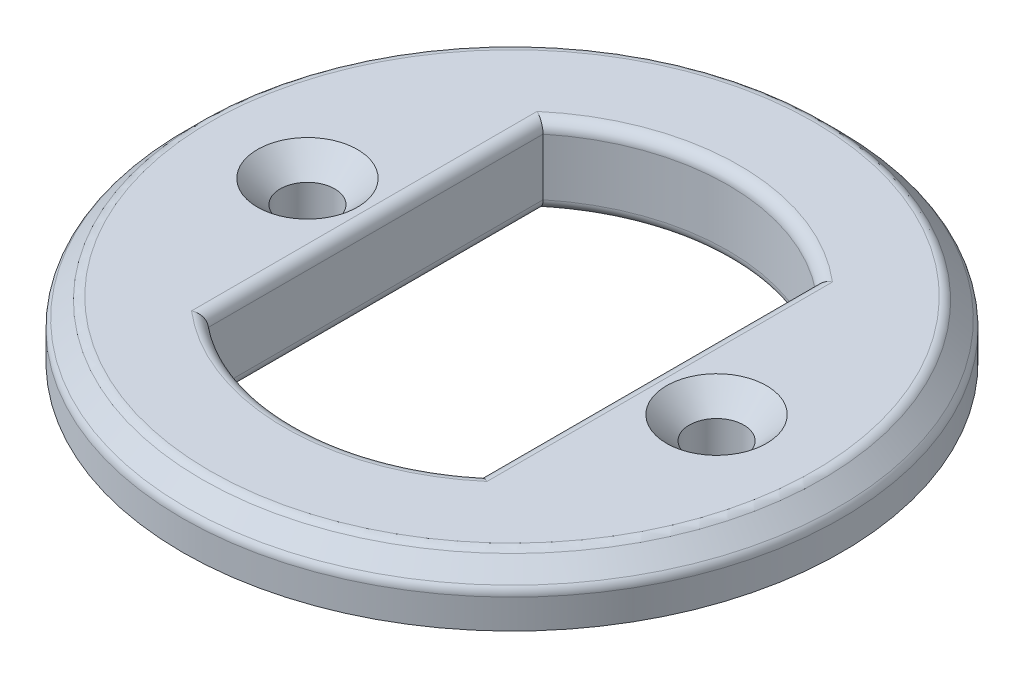
ISO-10303-21;
HEADER;
FILE_DESCRIPTION(('STEP AP214'),'2;1');
FILE_NAME('part.step','',(''),(''),'','','');
FILE_SCHEMA(('AUTOMOTIVE_DESIGN { 1 0 10303 214 1 1 1 1 }'));
ENDSEC;
DATA;
#1=APPLICATION_CONTEXT('core data for automotive mechanical design processes');
#2=APPLICATION_PROTOCOL_DEFINITION('international standard','automotive_design',2000,#1);
#3=PRODUCT_CONTEXT('',#1,'mechanical');
#4=PRODUCT('Part','Part','',(#3));
#5=PRODUCT_RELATED_PRODUCT_CATEGORY('part','',(#4));
#6=PRODUCT_DEFINITION_FORMATION('','',#4);
#7=PRODUCT_DEFINITION_CONTEXT('part definition',#1,'design');
#8=PRODUCT_DEFINITION('design','',#6,#7);
#9=PRODUCT_DEFINITION_SHAPE('','',#8);
#10=(LENGTH_UNIT() NAMED_UNIT(*) SI_UNIT(.MILLI.,.METRE.));
#11=(NAMED_UNIT(*) PLANE_ANGLE_UNIT() SI_UNIT($,.RADIAN.));
#12=(NAMED_UNIT(*) SI_UNIT($,.STERADIAN.) SOLID_ANGLE_UNIT());
#13=UNCERTAINTY_MEASURE_WITH_UNIT(LENGTH_MEASURE(1.E-05),#10,'distance_accuracy_value','');
#14=(GEOMETRIC_REPRESENTATION_CONTEXT(3) GLOBAL_UNCERTAINTY_ASSIGNED_CONTEXT((#13)) GLOBAL_UNIT_ASSIGNED_CONTEXT((#10,
#11,#12)) REPRESENTATION_CONTEXT('',''));
#15=CARTESIAN_POINT('',(0.,0.,0.));
#16=DIRECTION('',(0.,0.,1.));
#17=DIRECTION('',(1.,0.,0.));
#18=AXIS2_PLACEMENT_3D('',#15,#16,#17);
#19=CARTESIAN_POINT('',(12.,0.,0.));
#20=DIRECTION('',(0.,-1.,0.));
#21=DIRECTION('',(0.,0.,-1.));
#22=AXIS2_PLACEMENT_3D('',#19,#20,#21);
#23=PLANE('',#22);
#24=CARTESIAN_POINT('',(-9.,0.,0.));
#25=DIRECTION('',(0.,1.,0.));
#26=DIRECTION('',(0.,0.,1.));
#27=AXIS2_PLACEMENT_3D('',#24,#25,#26);
#28=CIRCLE('',#27,1.2);
#29=CARTESIAN_POINT('',(-9.,0.,1.2));
#30=VERTEX_POINT('',#29);
#31=EDGE_CURVE('E350',#30,#30,#28,.T.);
#32=ORIENTED_EDGE('',*,*,#31,.T.);
#33=EDGE_LOOP('',(#32));
#34=FACE_BOUND('',#33,.T.);
#35=CARTESIAN_POINT('',(9.,0.,0.));
#36=DIRECTION('',(0.,1.,0.));
#37=DIRECTION('',(0.,0.,1.));
#38=AXIS2_PLACEMENT_3D('',#35,#36,#37);
#39=CIRCLE('',#38,1.2);
#40=CARTESIAN_POINT('',(9.,0.,1.20000000000001));
#41=VERTEX_POINT('',#40);
#42=EDGE_CURVE('E360',#41,#41,#39,.T.);
#43=ORIENTED_EDGE('',*,*,#42,.T.);
#44=EDGE_LOOP('',(#43));
#45=FACE_BOUND('',#44,.T.);
#46=CARTESIAN_POINT('',(0.,0.,0.));
#47=DIRECTION('',(0.,-1.,0.));
#48=DIRECTION('',(0.,0.,-1.));
#49=AXIS2_PLACEMENT_3D('',#46,#47,#48);
#50=CIRCLE('',#49,10.);
#51=CARTESIAN_POINT('',(-6.5,0.,7.59934207678536));
#52=VERTEX_POINT('',#51);
#53=CARTESIAN_POINT('',(6.5,0.,7.59934207678531));
#54=VERTEX_POINT('',#53);
#55=EDGE_CURVE('E52',#52,#54,#50,.F.);
#56=ORIENTED_EDGE('',*,*,#55,.T.);
#57=DIRECTION('',(0.,0.,-1.));
#58=VECTOR('',#57,1.);
#59=CARTESIAN_POINT('',(6.49999999999997,0.,-7.36545993132812));
#60=LINE('',#59,#58);
#61=CARTESIAN_POINT('',(6.49999999999997,0.,-7.59934207678533));
#62=VERTEX_POINT('',#61);
#63=EDGE_CURVE('E11',#54,#62,#60,.T.);
#64=ORIENTED_EDGE('',*,*,#63,.T.);
#65=CARTESIAN_POINT('',(0.,0.,0.));
#66=DIRECTION('',(0.,-1.,0.));
#67=DIRECTION('',(0.,0.,-1.));
#68=AXIS2_PLACEMENT_3D('',#65,#66,#67);
#69=CIRCLE('',#68,10.);
#70=CARTESIAN_POINT('',(-6.5,0.,-7.59934207678532));
#71=VERTEX_POINT('',#70);
#72=EDGE_CURVE('E158',#62,#71,#69,.F.);
#73=ORIENTED_EDGE('',*,*,#72,.T.);
#74=DIRECTION('',(0.,0.,1.));
#75=VECTOR('',#74,1.);
#76=CARTESIAN_POINT('',(-6.5,0.,7.36545993132814));
#77=LINE('',#76,#75);
#78=EDGE_CURVE('E63',#71,#52,#77,.T.);
#79=ORIENTED_EDGE('',*,*,#78,.T.);
#80=EDGE_LOOP('',(#56,#64,#73,#79));
#81=FACE_BOUND('',#80,.T.);
#82=CARTESIAN_POINT('',(0.,0.,0.));
#83=DIRECTION('',(0.,-1.,0.));
#84=DIRECTION('',(0.,0.,-1.));
#85=AXIS2_PLACEMENT_3D('',#82,#83,#84);
#86=CIRCLE('',#85,12.);
#87=CARTESIAN_POINT('',(0.,0.,-12.));
#88=VERTEX_POINT('',#87);
#89=EDGE_CURVE('E287',#88,#88,#86,.T.);
#90=ORIENTED_EDGE('',*,*,#89,.T.);
#91=EDGE_LOOP('',(#90));
#92=FACE_BOUND('',#91,.T.);
#93=ADVANCED_FACE('F39',(#34,#45,#81,#92),#23,.T.);
#94=CARTESIAN_POINT('',(13.4999999999999,3.5,0.));
#95=DIRECTION('',(0.,1.,0.));
#96=DIRECTION('',(0.,0.,1.));
#97=AXIS2_PLACEMENT_3D('',#94,#95,#96);
#98=PLANE('',#97);
#99=CARTESIAN_POINT('',(-9.,3.5,0.));
#100=DIRECTION('',(0.,1.,0.));
#101=DIRECTION('',(0.,0.,1.));
#102=AXIS2_PLACEMENT_3D('',#99,#100,#101);
#103=CIRCLE('',#102,2.2);
#104=CARTESIAN_POINT('',(-9.,3.5,2.20000000000001));
#105=VERTEX_POINT('',#104);
#106=EDGE_CURVE('E348',#105,#105,#103,.T.);
#107=ORIENTED_EDGE('',*,*,#106,.F.);
#108=EDGE_LOOP('',(#107));
#109=FACE_BOUND('',#108,.T.);
#110=CARTESIAN_POINT('',(9.,3.5,0.));
#111=DIRECTION('',(0.,1.,0.));
#112=DIRECTION('',(0.,0.,1.));
#113=AXIS2_PLACEMENT_3D('',#110,#111,#112);
#114=CIRCLE('',#113,2.2);
#115=CARTESIAN_POINT('',(9.,3.5,2.20000000000001));
#116=VERTEX_POINT('',#115);
#117=EDGE_CURVE('E354',#116,#116,#114,.T.);
#118=ORIENTED_EDGE('',*,*,#117,.F.);
#119=EDGE_LOOP('',(#118));
#120=FACE_BOUND('',#119,.T.);
#121=CARTESIAN_POINT('',(0.,3.5,0.));
#122=DIRECTION('',(0.,1.,0.));
#123=DIRECTION('',(0.,0.,1.));
#124=AXIS2_PLACEMENT_3D('',#121,#122,#123);
#125=CIRCLE('',#124,13.2928932188135);
#126=CARTESIAN_POINT('',(0.,3.5,13.2928932188135));
#127=VERTEX_POINT('',#126);
#128=EDGE_CURVE('E135',#127,#127,#125,.T.);
#129=ORIENTED_EDGE('',*,*,#128,.T.);
#130=EDGE_LOOP('',(#129));
#131=FACE_BOUND('',#130,.T.);
#132=CARTESIAN_POINT('',(0.,3.5,0.));
#133=DIRECTION('',(0.,1.,0.));
#134=DIRECTION('',(0.,0.,1.));
#135=AXIS2_PLACEMENT_3D('',#132,#133,#134);
#136=CIRCLE('',#135,10.);
#137=CARTESIAN_POINT('',(-6.5,3.5,-7.59934207678534));
#138=VERTEX_POINT('',#137);
#139=CARTESIAN_POINT('',(6.5,3.5,-7.59934207678535));
#140=VERTEX_POINT('',#139);
#141=EDGE_CURVE('E134',#138,#140,#136,.F.);
#142=ORIENTED_EDGE('',*,*,#141,.T.);
#143=DIRECTION('',(0.,0.,-1.));
#144=VECTOR('',#143,1.);
#145=CARTESIAN_POINT('',(6.5,3.5,7.36545993132809));
#146=LINE('',#145,#144);
#147=CARTESIAN_POINT('',(6.50000000000003,3.5,7.59934207678531));
#148=VERTEX_POINT('',#147);
#149=EDGE_CURVE('E113',#140,#148,#146,.F.);
#150=ORIENTED_EDGE('',*,*,#149,.T.);
#151=CARTESIAN_POINT('',(0.,3.5,0.));
#152=DIRECTION('',(0.,1.,0.));
#153=DIRECTION('',(0.,0.,1.));
#154=AXIS2_PLACEMENT_3D('',#151,#152,#153);
#155=CIRCLE('',#154,10.);
#156=CARTESIAN_POINT('',(-6.5,3.5,7.59934207678531));
#157=VERTEX_POINT('',#156);
#158=EDGE_CURVE('E123',#148,#157,#155,.F.);
#159=ORIENTED_EDGE('',*,*,#158,.T.);
#160=DIRECTION('',(0.,0.,1.));
#161=VECTOR('',#160,1.);
#162=CARTESIAN_POINT('',(-6.5,3.5,-7.36545993132812));
#163=LINE('',#162,#161);
#164=EDGE_CURVE('E129',#157,#138,#163,.F.);
#165=ORIENTED_EDGE('',*,*,#164,.T.);
#166=EDGE_LOOP('',(#142,#150,#159,#165));
#167=FACE_BOUND('',#166,.T.);
#168=ADVANCED_FACE('F132',(#109,#120,#131,#167),#98,.T.);
#169=CARTESIAN_POINT('',(0.,2.5,0.));
#170=DIRECTION('',(0.,-1.,0.));
#171=DIRECTION('',(0.,0.,-1.));
#172=AXIS2_PLACEMENT_3D('',#169,#170,#171);
#173=CONICAL_SURFACE('',#172,14.5,0.785398163397448);
#174=CARTESIAN_POINT('',(0.,2.64644660940673,0.));
#175=DIRECTION('',(0.,1.,0.));
#176=DIRECTION('',(0.,0.,1.));
#177=AXIS2_PLACEMENT_3D('',#174,#175,#176);
#178=CIRCLE('',#177,14.3535533905933);
#179=CARTESIAN_POINT('',(0.,2.64644660940673,14.3535533905933));
#180=VERTEX_POINT('',#179);
#181=EDGE_CURVE('E130',#180,#180,#178,.T.);
#182=ORIENTED_EDGE('',*,*,#181,.T.);
#183=EDGE_LOOP('',(#182));
#184=FACE_BOUND('',#183,.T.);
#185=CARTESIAN_POINT('',(0.,3.35355339059328,0.));
#186=DIRECTION('',(0.,1.,0.));
#187=DIRECTION('',(0.,0.,1.));
#188=AXIS2_PLACEMENT_3D('',#185,#186,#187);
#189=CIRCLE('',#188,13.6464466094067);
#190=CARTESIAN_POINT('',(0.,3.35355339059328,13.6464466094067));
#191=VERTEX_POINT('',#190);
#192=EDGE_CURVE('E254',#191,#191,#189,.F.);
#193=ORIENTED_EDGE('',*,*,#192,.T.);
#194=EDGE_LOOP('',(#193));
#195=FACE_BOUND('',#194,.T.);
#196=ADVANCED_FACE('F235',(#184,#195),#173,.T.);
#197=CARTESIAN_POINT('',(0.,-5.34736842105263,0.));
#198=DIRECTION('',(0.,-1.,0.));
#199=DIRECTION('',(0.,0.,-1.));
#200=AXIS2_PLACEMENT_3D('',#197,#198,#199);
#201=CYLINDRICAL_SURFACE('',#200,14.5);
#202=CARTESIAN_POINT('',(0.,2.29289321881345,0.));
#203=DIRECTION('',(0.,1.,0.));
#204=DIRECTION('',(0.,0.,1.));
#205=AXIS2_PLACEMENT_3D('',#202,#203,#204);
#206=CIRCLE('',#205,14.5);
#207=CARTESIAN_POINT('',(0.,2.29289321881345,14.5));
#208=VERTEX_POINT('',#207);
#209=EDGE_CURVE('E256',#208,#208,#206,.F.);
#210=ORIENTED_EDGE('',*,*,#209,.T.);
#211=EDGE_LOOP('',(#210));
#212=FACE_BOUND('',#211,.T.);
#213=CARTESIAN_POINT('',(0.,1.,0.));
#214=DIRECTION('',(0.,-1.,0.));
#215=DIRECTION('',(0.,0.,-1.));
#216=AXIS2_PLACEMENT_3D('',#213,#214,#215);
#217=CIRCLE('',#216,14.5);
#218=CARTESIAN_POINT('',(0.,1.,-14.5));
#219=VERTEX_POINT('',#218);
#220=EDGE_CURVE('E261',#219,#219,#217,.T.);
#221=ORIENTED_EDGE('',*,*,#220,.F.);
#222=EDGE_LOOP('',(#221));
#223=FACE_BOUND('',#222,.T.);
#224=ADVANCED_FACE('F298',(#212,#223),#201,.T.);
#225=CARTESIAN_POINT('',(12.,1.,0.));
#226=DIRECTION('',(0.,-1.,0.));
#227=DIRECTION('',(0.,0.,-1.));
#228=AXIS2_PLACEMENT_3D('',#225,#226,#227);
#229=PLANE('',#228);
#230=ORIENTED_EDGE('',*,*,#220,.T.);
#231=EDGE_LOOP('',(#230));
#232=FACE_BOUND('',#231,.T.);
#233=CARTESIAN_POINT('',(0.,1.,0.));
#234=DIRECTION('',(0.,-1.,0.));
#235=DIRECTION('',(0.,0.,-1.));
#236=AXIS2_PLACEMENT_3D('',#233,#234,#235);
#237=CIRCLE('',#236,12.);
#238=CARTESIAN_POINT('',(0.,1.,-12.));
#239=VERTEX_POINT('',#238);
#240=EDGE_CURVE('E290',#239,#239,#237,.T.);
#241=ORIENTED_EDGE('',*,*,#240,.F.);
#242=EDGE_LOOP('',(#241));
#243=FACE_BOUND('',#242,.T.);
#244=ADVANCED_FACE('F295',(#232,#243),#229,.T.);
#245=CARTESIAN_POINT('',(0.,-5.34736842105263,0.));
#246=DIRECTION('',(0.,-1.,0.));
#247=DIRECTION('',(0.,0.,-1.));
#248=AXIS2_PLACEMENT_3D('',#245,#246,#247);
#249=CYLINDRICAL_SURFACE('',#248,12.);
#250=ORIENTED_EDGE('',*,*,#240,.T.);
#251=EDGE_LOOP('',(#250));
#252=FACE_BOUND('',#251,.T.);
#253=ORIENTED_EDGE('',*,*,#89,.F.);
#254=EDGE_LOOP('',(#253));
#255=FACE_BOUND('',#254,.T.);
#256=ADVANCED_FACE('F306',(#252,#255),#249,.T.);
#257=CARTESIAN_POINT('',(0.,0.,0.));
#258=DIRECTION('',(0.,1.,0.));
#259=DIRECTION('',(0.,0.,1.));
#260=AXIS2_PLACEMENT_3D('',#257,#258,#259);
#261=CYLINDRICAL_SURFACE('',#260,9.5);
#262=DIRECTION('',(0.,1.,0.));
#263=VECTOR('',#262,1.);
#264=CARTESIAN_POINT('',(-6.,0.,7.36545993132812));
#265=LINE('',#264,#263);
#266=CARTESIAN_POINT('',(-6.,0.500000000000001,7.36545993132812));
#267=VERTEX_POINT('',#266);
#268=CARTESIAN_POINT('',(-6.,3.,7.36545993132812));
#269=VERTEX_POINT('',#268);
#270=EDGE_CURVE('E282',#267,#269,#265,.T.);
#271=ORIENTED_EDGE('',*,*,#270,.T.);
#272=CARTESIAN_POINT('',(0.,3.,0.));
#273=DIRECTION('',(0.,1.,0.));
#274=DIRECTION('',(0.,0.,1.));
#275=AXIS2_PLACEMENT_3D('',#272,#273,#274);
#276=CIRCLE('',#275,9.5);
#277=CARTESIAN_POINT('',(6.,3.,7.36545993132811));
#278=VERTEX_POINT('',#277);
#279=EDGE_CURVE('E156',#269,#278,#276,.T.);
#280=ORIENTED_EDGE('',*,*,#279,.T.);
#281=DIRECTION('',(0.,1.,0.));
#282=VECTOR('',#281,1.);
#283=CARTESIAN_POINT('',(5.99999999999997,0.,7.36545993132812));
#284=LINE('',#283,#282);
#285=CARTESIAN_POINT('',(5.99999999999997,0.5,7.36545993132812));
#286=VERTEX_POINT('',#285);
#287=EDGE_CURVE('E277',#286,#278,#284,.T.);
#288=ORIENTED_EDGE('',*,*,#287,.F.);
#289=CARTESIAN_POINT('',(0.,0.5,0.));
#290=DIRECTION('',(0.,-1.,0.));
#291=DIRECTION('',(0.,0.,-1.));
#292=AXIS2_PLACEMENT_3D('',#289,#290,#291);
#293=CIRCLE('',#292,9.5);
#294=EDGE_CURVE('E154',#286,#267,#293,.T.);
#295=ORIENTED_EDGE('',*,*,#294,.T.);
#296=EDGE_LOOP('',(#271,#280,#288,#295));
#297=FACE_BOUND('',#296,.T.);
#298=ADVANCED_FACE('F312',(#297),#261,.F.);
#299=CARTESIAN_POINT('',(-6.,0.,7.36545993132812));
#300=DIRECTION('',(-1.,0.,0.));
#301=DIRECTION('',(0.,0.,1.));
#302=AXIS2_PLACEMENT_3D('',#299,#300,#301);
#303=PLANE('',#302);
#304=DIRECTION('',(0.,1.,0.));
#305=VECTOR('',#304,1.);
#306=CARTESIAN_POINT('',(-6.,0.,-7.36545993132812));
#307=LINE('',#306,#305);
#308=CARTESIAN_POINT('',(-6.,0.500000000000001,-7.36545993132812));
#309=VERTEX_POINT('',#308);
#310=CARTESIAN_POINT('',(-6.,3.,-7.36545993132813));
#311=VERTEX_POINT('',#310);
#312=EDGE_CURVE('E280',#309,#311,#307,.T.);
#313=ORIENTED_EDGE('',*,*,#312,.T.);
#314=DIRECTION('',(0.,0.,1.));
#315=VECTOR('',#314,1.);
#316=CARTESIAN_POINT('',(-6.,3.,7.36545993132812));
#317=LINE('',#316,#315);
#318=EDGE_CURVE('E152',#311,#269,#317,.T.);
#319=ORIENTED_EDGE('',*,*,#318,.T.);
#320=ORIENTED_EDGE('',*,*,#270,.F.);
#321=DIRECTION('',(0.,0.,1.));
#322=VECTOR('',#321,1.);
#323=CARTESIAN_POINT('',(-6.,0.500000000000001,-7.36545993132812));
#324=LINE('',#323,#322);
#325=EDGE_CURVE('E150',#267,#309,#324,.F.);
#326=ORIENTED_EDGE('',*,*,#325,.T.);
#327=EDGE_LOOP('',(#313,#319,#320,#326));
#328=FACE_BOUND('',#327,.T.);
#329=ADVANCED_FACE('F316',(#328),#303,.F.);
#330=CARTESIAN_POINT('',(0.,0.,0.));
#331=DIRECTION('',(0.,1.,0.));
#332=DIRECTION('',(0.,0.,1.));
#333=AXIS2_PLACEMENT_3D('',#330,#331,#332);
#334=CYLINDRICAL_SURFACE('',#333,9.5);
#335=DIRECTION('',(0.,1.,0.));
#336=VECTOR('',#335,1.);
#337=CARTESIAN_POINT('',(5.99999999999998,0.,-7.36545993132811));
#338=LINE('',#337,#336);
#339=CARTESIAN_POINT('',(5.99999999999998,0.5,-7.36545993132811));
#340=VERTEX_POINT('',#339);
#341=CARTESIAN_POINT('',(6.,3.,-7.36545993132812));
#342=VERTEX_POINT('',#341);
#343=EDGE_CURVE('E274',#340,#342,#338,.T.);
#344=ORIENTED_EDGE('',*,*,#343,.T.);
#345=CARTESIAN_POINT('',(0.,3.,0.));
#346=DIRECTION('',(0.,1.,0.));
#347=DIRECTION('',(0.,0.,1.));
#348=AXIS2_PLACEMENT_3D('',#345,#346,#347);
#349=CIRCLE('',#348,9.5);
#350=EDGE_CURVE('E148',#342,#311,#349,.T.);
#351=ORIENTED_EDGE('',*,*,#350,.T.);
#352=ORIENTED_EDGE('',*,*,#312,.F.);
#353=CARTESIAN_POINT('',(0.,0.5,0.));
#354=DIRECTION('',(0.,-1.,0.));
#355=DIRECTION('',(0.,0.,-1.));
#356=AXIS2_PLACEMENT_3D('',#353,#354,#355);
#357=CIRCLE('',#356,9.5);
#358=EDGE_CURVE('E146',#309,#340,#357,.T.);
#359=ORIENTED_EDGE('',*,*,#358,.T.);
#360=EDGE_LOOP('',(#344,#351,#352,#359));
#361=FACE_BOUND('',#360,.T.);
#362=ADVANCED_FACE('F278',(#361),#334,.F.);
#363=CARTESIAN_POINT('',(5.99999999999997,0.,-7.36545993132811));
#364=DIRECTION('',(1.,0.,0.));
#365=DIRECTION('',(0.,0.,-1.));
#366=AXIS2_PLACEMENT_3D('',#363,#364,#365);
#367=PLANE('',#366);
#368=ORIENTED_EDGE('',*,*,#287,.T.);
#369=DIRECTION('',(0.,0.,-1.));
#370=VECTOR('',#369,1.);
#371=CARTESIAN_POINT('',(6.,3.,-7.36545993132812));
#372=LINE('',#371,#370);
#373=EDGE_CURVE('E116',#278,#342,#372,.T.);
#374=ORIENTED_EDGE('',*,*,#373,.T.);
#375=ORIENTED_EDGE('',*,*,#343,.F.);
#376=DIRECTION('',(0.,0.,-1.));
#377=VECTOR('',#376,1.);
#378=CARTESIAN_POINT('',(5.99999999999997,0.5,7.36545993132812));
#379=LINE('',#378,#377);
#380=EDGE_CURVE('E138',#340,#286,#379,.F.);
#381=ORIENTED_EDGE('',*,*,#380,.T.);
#382=EDGE_LOOP('',(#368,#374,#375,#381));
#383=FACE_BOUND('',#382,.T.);
#384=ADVANCED_FACE('F244',(#383),#367,.F.);
#385=CARTESIAN_POINT('',(0.,2.29289321881345,0.));
#386=DIRECTION('',(0.,1.,0.));
#387=DIRECTION('',(0.,0.,1.));
#388=AXIS2_PLACEMENT_3D('',#385,#386,#387);
#389=TOROIDAL_SURFACE('',#388,14.,0.5);
#390=ORIENTED_EDGE('',*,*,#181,.F.);
#391=EDGE_LOOP('',(#390));
#392=FACE_BOUND('',#391,.T.);
#393=ORIENTED_EDGE('',*,*,#209,.F.);
#394=EDGE_LOOP('',(#393));
#395=FACE_BOUND('',#394,.T.);
#396=ADVANCED_FACE('F242',(#392,#395),#389,.T.);
#397=CARTESIAN_POINT('',(0.,3.,0.));
#398=DIRECTION('',(0.,1.,0.));
#399=DIRECTION('',(0.,0.,1.));
#400=AXIS2_PLACEMENT_3D('',#397,#398,#399);
#401=TOROIDAL_SURFACE('',#400,13.2928932188135,0.5);
#402=ORIENTED_EDGE('',*,*,#128,.F.);
#403=EDGE_LOOP('',(#402));
#404=FACE_BOUND('',#403,.T.);
#405=ORIENTED_EDGE('',*,*,#192,.F.);
#406=EDGE_LOOP('',(#405));
#407=FACE_BOUND('',#406,.T.);
#408=ADVANCED_FACE('F194',(#404,#407),#401,.T.);
#409=CARTESIAN_POINT('',(-6.5,3.,7.36545993132809));
#410=DIRECTION('',(0.,0.,-1.));
#411=DIRECTION('',(-1.,0.,0.));
#412=AXIS2_PLACEMENT_3D('',#409,#410,#411);
#413=CYLINDRICAL_SURFACE('',#412,0.5);
#414=CARTESIAN_POINT('',(-6.,3.,-7.36545993132813));
#415=CARTESIAN_POINT('',(-5.99996883556375,3.02619548218189,-7.36544438616921));
#416=CARTESIAN_POINT('',(-6.0020564014371,3.0523676580606,-7.36643711433948));
#417=CARTESIAN_POINT('',(-6.01022094099743,3.10385019665003,-7.37031567581809));
#418=CARTESIAN_POINT('',(-6.0162843597262,3.12916318130929,-7.37319507682896));
#419=CARTESIAN_POINT('',(-6.03215155563501,3.17828728681383,-7.38072314227529));
#420=CARTESIAN_POINT('',(-6.04195344579023,3.20209915830411,-7.38537091410787));
#421=CARTESIAN_POINT('',(-6.06490112507688,3.247668829099,-7.39623806449386));
#422=CARTESIAN_POINT('',(-6.0780487707702,3.26942547873858,-7.40245831560438));
#423=CARTESIAN_POINT('',(-6.1078069955548,3.31123808690766,-7.41651535957782));
#424=CARTESIAN_POINT('',(-6.12453408487105,3.33119258627701,-7.42440641113765));
#425=CARTESIAN_POINT('',(-6.16056346401052,3.3680316164777,-7.44137192988482));
#426=CARTESIAN_POINT('',(-6.17986656579319,3.38491517536702,-7.45044677018213));
#427=CARTESIAN_POINT('',(-6.22238030421825,3.41676842880824,-7.47039291501638));
#428=CARTESIAN_POINT('',(-6.24578692386825,3.43142092575799,-7.48135263868905));
#429=CARTESIAN_POINT('',(-6.29438690659029,3.45658802361377,-7.50405471734737));
#430=CARTESIAN_POINT('',(-6.31958125001191,3.46710033310729,-7.51579750153082));
#431=CARTESIAN_POINT('',(-6.36967268633897,3.48339381451354,-7.53908727176485));
#432=CARTESIAN_POINT('',(-6.39450724561764,3.48940720290248,-7.55060832167117));
#433=CARTESIAN_POINT('',(-6.44467758904669,3.49757734045328,-7.57382845087341));
#434=CARTESIAN_POINT('',(-6.47001223658348,3.49974200053452,-7.58552711502284));
#435=CARTESIAN_POINT('',(-6.49689368441917,3.49999277828822,-7.59791131267363));
#436=CARTESIAN_POINT('',(-6.49844688677978,3.50000001649187,-7.59862676625917));
#437=CARTESIAN_POINT('',(-6.5,3.5,-7.59934207678533));
#438=B_SPLINE_CURVE_WITH_KNOTS('',3,(#414,#415,#416,#417,#418,#419,#420,#421,#422,#423,#424,
#425,#426,#427,#428,#429,#430,#431,#432,#433,#434,#435,#436,#437),.UNSPECIFIED.,.F.,.F.,(4,2,2,
2,2,2,2,2,2,2,2,4),(0.,0.0784482692813732,0.156630464212981,0.234773248140515,0.312959488462669,
0.394241764246778,0.475549720995265,0.564309141687095,0.653117618030579,0.736946836540826,
0.820603547103793,0.825733706874859),.UNSPECIFIED.);
#439=EDGE_CURVE('E119',#138,#311,#438,.F.);
#440=ORIENTED_EDGE('',*,*,#439,.F.);
#441=ORIENTED_EDGE('',*,*,#164,.F.);
#442=CARTESIAN_POINT('',(-6.,3.,7.36545993132812));
#443=CARTESIAN_POINT('',(-5.99996883556374,3.02619548218188,7.36544438616921));
#444=CARTESIAN_POINT('',(-6.00205640143709,3.05236765806059,7.36643711433948));
#445=CARTESIAN_POINT('',(-6.01022094099743,3.10385019665002,7.3703156758181));
#446=CARTESIAN_POINT('',(-6.0162843597262,3.12916318130928,7.37319507682896));
#447=CARTESIAN_POINT('',(-6.03215155563501,3.17828728681382,7.38072314227528));
#448=CARTESIAN_POINT('',(-6.04195344579022,3.2020991583041,7.38537091410786));
#449=CARTESIAN_POINT('',(-6.06490112507688,3.247668829099,7.39623806449386));
#450=CARTESIAN_POINT('',(-6.0780487707702,3.26942547873857,7.40245831560437));
#451=CARTESIAN_POINT('',(-6.10780699555481,3.31123808690765,7.41651535957782));
#452=CARTESIAN_POINT('',(-6.12453408487105,3.331192586277,7.42440641113766));
#453=CARTESIAN_POINT('',(-6.16056346401052,3.3680316164777,7.44137192988482));
#454=CARTESIAN_POINT('',(-6.17986656579319,3.38491517536702,7.45044677018213));
#455=CARTESIAN_POINT('',(-6.22238030421825,3.41676842880823,7.47039291501637));
#456=CARTESIAN_POINT('',(-6.24578692386824,3.43142092575798,7.48135263868905));
#457=CARTESIAN_POINT('',(-6.29438690659028,3.45658802361377,7.50405471734736));
#458=CARTESIAN_POINT('',(-6.31958125001189,3.46710033310729,7.5157975015308));
#459=CARTESIAN_POINT('',(-6.36967268633896,3.48339381451353,7.53908727176484));
#460=CARTESIAN_POINT('',(-6.39450724561763,3.48940720290247,7.55060832167117));
#461=CARTESIAN_POINT('',(-6.44467758904669,3.49757734045328,7.5738284508734));
#462=CARTESIAN_POINT('',(-6.47001223658348,3.49974200053456,7.58552711502281));
#463=CARTESIAN_POINT('',(-6.49689368441917,3.49999277828822,7.59791131267361));
#464=CARTESIAN_POINT('',(-6.49844688677978,3.50000001649187,7.59862676625915));
#465=CARTESIAN_POINT('',(-6.5,3.5,7.59934207678531));
#466=B_SPLINE_CURVE_WITH_KNOTS('',3,(#442,#443,#444,#445,#446,#447,#448,#449,#450,#451,#452,
#453,#454,#455,#456,#457,#458,#459,#460,#461,#462,#463,#464,#465),.UNSPECIFIED.,.F.,.F.,(4,2,2,
2,2,2,2,2,2,2,2,4),(0.,0.0784482692813737,0.156630464212981,0.234773248140514,0.31295948846267,
0.394241764246783,0.475549720995271,0.564309141687087,0.653117618030566,0.736946836540822,
0.820603547103789,0.825733706874854),.UNSPECIFIED.);
#467=EDGE_CURVE('E126',#269,#157,#466,.T.);
#468=ORIENTED_EDGE('',*,*,#467,.F.);
#469=ORIENTED_EDGE('',*,*,#318,.F.);
#470=EDGE_LOOP('',(#440,#441,#468,#469));
#471=FACE_BOUND('',#470,.T.);
#472=ADVANCED_FACE('F190',(#471),#413,.T.);
#473=CARTESIAN_POINT('',(0.,3.,0.));
#474=DIRECTION('',(0.,1.,0.));
#475=DIRECTION('',(0.,0.,1.));
#476=AXIS2_PLACEMENT_3D('',#473,#474,#475);
#477=TOROIDAL_SURFACE('',#476,10.,0.5);
#478=ORIENTED_EDGE('',*,*,#467,.T.);
#479=ORIENTED_EDGE('',*,*,#158,.F.);
#480=CARTESIAN_POINT('',(6.,3.,7.36545993132811));
#481=CARTESIAN_POINT('',(5.99996883556372,3.02619548218189,7.3654443861692));
#482=CARTESIAN_POINT('',(6.00205640143708,3.05236765806059,7.36643711433947));
#483=CARTESIAN_POINT('',(6.01022094099744,3.10385019665002,7.37031567581809));
#484=CARTESIAN_POINT('',(6.01628435972623,3.12916318130928,7.37319507682896));
#485=CARTESIAN_POINT('',(6.03215155563504,3.17828728681383,7.38072314227529));
#486=CARTESIAN_POINT('',(6.04195344579023,3.20209915830411,7.38537091410787));
#487=CARTESIAN_POINT('',(6.06490112507688,3.24766882909901,7.39623806449386));
#488=CARTESIAN_POINT('',(6.07804877077022,3.26942547873857,7.40245831560437));
#489=CARTESIAN_POINT('',(6.10780699555483,3.31123808690765,7.41651535957782));
#490=CARTESIAN_POINT('',(6.12453408487106,3.33119258627701,7.42440641113766));
#491=CARTESIAN_POINT('',(6.16056346401052,3.36803161647771,7.44137192988483));
#492=CARTESIAN_POINT('',(6.1798665657932,3.38491517536702,7.45044677018212));
#493=CARTESIAN_POINT('',(6.22238030421825,3.41676842880824,7.47039291501638));
#494=CARTESIAN_POINT('',(6.24578692386824,3.431420925758,7.48135263868907));
#495=CARTESIAN_POINT('',(6.2943869065903,3.45658802361378,7.50405471734738));
#496=CARTESIAN_POINT('',(6.31958125001194,3.46710033310729,7.51579750153079));
#497=CARTESIAN_POINT('',(6.369672686339,3.48339381451353,7.53908727176483));
#498=CARTESIAN_POINT('',(6.39450724561765,3.48940720290249,7.5506083216712));
#499=CARTESIAN_POINT('',(6.44467758904666,3.49757734045328,7.57382845087347));
#500=CARTESIAN_POINT('',(6.47001223658344,3.49974200053452,7.5855271150229));
#501=CARTESIAN_POINT('',(6.49689368441918,3.49999277828822,7.59791131267361));
#502=CARTESIAN_POINT('',(6.4984468867798,3.50000001649187,7.59862676625915));
#503=CARTESIAN_POINT('',(6.50000000000003,3.5,7.5993420767853));
#504=B_SPLINE_CURVE_WITH_KNOTS('',3,(#480,#481,#482,#483,#484,#485,#486,#487,#488,#489,#490,
#491,#492,#493,#494,#495,#496,#497,#498,#499,#500,#501,#502,#503),.UNSPECIFIED.,.F.,.F.,(4,2,2,
2,2,2,2,2,2,2,2,4),(0.,0.0784482692813767,0.156630464212988,0.234773248140523,0.31295948846268,
0.394241764246786,0.475549720995265,0.564309141687106,0.653117618030603,0.736946836540834,
0.820603547103781,0.825733706874872),.UNSPECIFIED.);
#505=EDGE_CURVE('E109',#278,#148,#504,.T.);
#506=ORIENTED_EDGE('',*,*,#505,.F.);
#507=ORIENTED_EDGE('',*,*,#279,.F.);
#508=EDGE_LOOP('',(#478,#479,#506,#507));
#509=FACE_BOUND('',#508,.T.);
#510=ADVANCED_FACE('F124',(#509),#477,.T.);
#511=CARTESIAN_POINT('',(0.,3.,0.));
#512=DIRECTION('',(0.,1.,0.));
#513=DIRECTION('',(0.,0.,1.));
#514=AXIS2_PLACEMENT_3D('',#511,#512,#513);
#515=TOROIDAL_SURFACE('',#514,10.,0.5);
#516=ORIENTED_EDGE('',*,*,#439,.T.);
#517=ORIENTED_EDGE('',*,*,#350,.F.);
#518=CARTESIAN_POINT('',(6.,3.,-7.36545993132812));
#519=CARTESIAN_POINT('',(5.99996883556374,3.02619548218189,-7.3654443861692));
#520=CARTESIAN_POINT('',(6.0020564014371,3.0523676580606,-7.36643711433947));
#521=CARTESIAN_POINT('',(6.01022094099743,3.10385019665003,-7.3703156758181));
#522=CARTESIAN_POINT('',(6.01628435972621,3.12916318130929,-7.37319507682896));
#523=CARTESIAN_POINT('',(6.03215155563501,3.17828728681383,-7.38072314227528));
#524=CARTESIAN_POINT('',(6.04195344579022,3.20209915830412,-7.38537091410786));
#525=CARTESIAN_POINT('',(6.06490112507689,3.24766882909901,-7.39623806449387));
#526=CARTESIAN_POINT('',(6.07804877077022,3.26942547873857,-7.40245831560439));
#527=CARTESIAN_POINT('',(6.10780699555483,3.31123808690766,-7.41651535957783));
#528=CARTESIAN_POINT('',(6.12453408487106,3.33119258627702,-7.42440641113766));
#529=CARTESIAN_POINT('',(6.16056346401052,3.36803161647771,-7.44137192988483));
#530=CARTESIAN_POINT('',(6.1798665657932,3.38491517536702,-7.45044677018214));
#531=CARTESIAN_POINT('',(6.22238030421825,3.41676842880824,-7.47039291501639));
#532=CARTESIAN_POINT('',(6.24578692386824,3.431420925758,-7.48135263868907));
#533=CARTESIAN_POINT('',(6.2943869065903,3.45658802361378,-7.50405471734737));
#534=CARTESIAN_POINT('',(6.31958125001194,3.46710033310729,-7.51579750153079));
#535=CARTESIAN_POINT('',(6.369672686339,3.48339381451353,-7.53908727176484));
#536=CARTESIAN_POINT('',(6.39450724561764,3.48940720290249,-7.55060832167121));
#537=CARTESIAN_POINT('',(6.44467758904668,3.49757734045328,-7.57382845087347));
#538=CARTESIAN_POINT('',(6.47001223658347,3.49974200053452,-7.58552711502288));
#539=CARTESIAN_POINT('',(6.49689368441917,3.49999277828822,-7.59791131267365));
#540=CARTESIAN_POINT('',(6.49844688677978,3.50000001649187,-7.59862676625919));
#541=CARTESIAN_POINT('',(6.5,3.5,-7.59934207678535));
#542=B_SPLINE_CURVE_WITH_KNOTS('',3,(#518,#519,#520,#521,#522,#523,#524,#525,#526,#527,#528,
#529,#530,#531,#532,#533,#534,#535,#536,#537,#538,#539,#540,#541),.UNSPECIFIED.,.F.,.F.,(4,2,2,
2,2,2,2,2,2,2,2,4),(0.,0.0784482692813771,0.156630464212981,0.234773248140522,0.312959488462686,
0.394241764246788,0.475549720995267,0.564309141687102,0.653117618030594,0.736946836540836,
0.820603547103795,0.825733706874862),.UNSPECIFIED.);
#543=EDGE_CURVE('E120',#140,#342,#542,.F.);
#544=ORIENTED_EDGE('',*,*,#543,.F.);
#545=ORIENTED_EDGE('',*,*,#141,.F.);
#546=EDGE_LOOP('',(#516,#517,#544,#545));
#547=FACE_BOUND('',#546,.T.);
#548=ADVANCED_FACE('F174',(#547),#515,.T.);
#549=CARTESIAN_POINT('',(6.5,3.,-7.36545993132813));
#550=DIRECTION('',(0.,0.,1.));
#551=DIRECTION('',(1.,0.,0.));
#552=AXIS2_PLACEMENT_3D('',#549,#550,#551);
#553=CYLINDRICAL_SURFACE('',#552,0.5);
#554=ORIENTED_EDGE('',*,*,#505,.T.);
#555=ORIENTED_EDGE('',*,*,#149,.F.);
#556=ORIENTED_EDGE('',*,*,#543,.T.);
#557=ORIENTED_EDGE('',*,*,#373,.F.);
#558=EDGE_LOOP('',(#554,#555,#556,#557));
#559=FACE_BOUND('',#558,.T.);
#560=ADVANCED_FACE('F111',(#559),#553,.T.);
#561=CARTESIAN_POINT('',(-6.5,0.5,0.));
#562=DIRECTION('',(0.,0.,-1.));
#563=DIRECTION('',(-1.,0.,0.));
#564=AXIS2_PLACEMENT_3D('',#561,#562,#563);
#565=CYLINDRICAL_SURFACE('',#564,0.5);
#566=CARTESIAN_POINT('',(-6.,0.500000000000001,-7.36545993132812));
#567=CARTESIAN_POINT('',(-5.99996883556374,0.473804517818114,-7.36544438616921));
#568=CARTESIAN_POINT('',(-6.00205640143709,0.447632341939409,-7.36643711433948));
#569=CARTESIAN_POINT('',(-6.01022094099743,0.396149803349979,-7.37031567581809));
#570=CARTESIAN_POINT('',(-6.0162843597262,0.370836818690713,-7.37319507682895));
#571=CARTESIAN_POINT('',(-6.03215155563501,0.321712713186172,-7.38072314227527));
#572=CARTESIAN_POINT('',(-6.04195344579022,0.297900841695895,-7.38537091410787));
#573=CARTESIAN_POINT('',(-6.06490112507688,0.252331170901,-7.39623806449387));
#574=CARTESIAN_POINT('',(-6.0780487707702,0.230574521261428,-7.40245831560438));
#575=CARTESIAN_POINT('',(-6.1078069955548,0.188761913092343,-7.41651535957782));
#576=CARTESIAN_POINT('',(-6.12453408487105,0.168807413722996,-7.42440641113766));
#577=CARTESIAN_POINT('',(-6.16056346401052,0.131968383522302,-7.44137192988483));
#578=CARTESIAN_POINT('',(-6.17986656579319,0.115084824632988,-7.45044677018212));
#579=CARTESIAN_POINT('',(-6.22238030421825,0.0832315711917662,-7.47039291501638));
#580=CARTESIAN_POINT('',(-6.24578692386823,0.0685790742420117,-7.48135263868907));
#581=CARTESIAN_POINT('',(-6.29438690659028,0.0434119763862271,-7.50405471734737));
#582=CARTESIAN_POINT('',(-6.31958125001191,0.0328996668927109,-7.51579750153078));
#583=CARTESIAN_POINT('',(-6.36967268633897,0.0166061854864636,-7.53908727176483));
#584=CARTESIAN_POINT('',(-6.39450724561761,0.0105927970975166,-7.55060832167122));
#585=CARTESIAN_POINT('',(-6.44467758904667,0.00242265954672424,-7.57382845087345));
#586=CARTESIAN_POINT('',(-6.47001223658348,0.000257999465479998,-7.58552711502282));
#587=CARTESIAN_POINT('',(-6.49689368441917,7.22171177919634E-06,-7.59791131267362));
#588=CARTESIAN_POINT('',(-6.49844688677978,-1.6491870022349E-08,-7.59862676625916));
#589=CARTESIAN_POINT('',(-6.5,0.,-7.59934207678532));
#590=B_SPLINE_CURVE_WITH_KNOTS('',3,(#566,#567,#568,#569,#570,#571,#572,#573,#574,#575,#576,
#577,#578,#579,#580,#581,#582,#583,#584,#585,#586,#587,#588,#589),.UNSPECIFIED.,.F.,.F.,(4,2,2,
2,2,2,2,2,2,2,2,4),(0.,0.0784482692813726,0.15663046421298,0.234773248140515,0.312959488462671,
0.39424176424678,0.475549720995267,0.564309141687094,0.653117618030573,0.736946836540824,
0.820603547103794,0.82573370687486),.UNSPECIFIED.);
#591=EDGE_CURVE('E211',#309,#71,#590,.T.);
#592=ORIENTED_EDGE('',*,*,#591,.F.);
#593=ORIENTED_EDGE('',*,*,#325,.F.);
#594=CARTESIAN_POINT('',(-6.,0.500000000000001,7.36545993132812));
#595=CARTESIAN_POINT('',(-5.99996883556374,0.473804517818113,7.36544438616921));
#596=CARTESIAN_POINT('',(-6.00205640143709,0.447632341939408,7.36643711433948));
#597=CARTESIAN_POINT('',(-6.01022094099743,0.396149803349979,7.3703156758181));
#598=CARTESIAN_POINT('',(-6.0162843597262,0.370836818690714,7.37319507682896));
#599=CARTESIAN_POINT('',(-6.03215155563501,0.321712713186172,7.38072314227528));
#600=CARTESIAN_POINT('',(-6.04195344579022,0.297900841695894,7.38537091410787));
#601=CARTESIAN_POINT('',(-6.06490112507688,0.252331170900999,7.39623806449387));
#602=CARTESIAN_POINT('',(-6.0780487707702,0.230574521261428,7.40245831560437));
#603=CARTESIAN_POINT('',(-6.1078069955548,0.188761913092343,7.41651535957782));
#604=CARTESIAN_POINT('',(-6.12453408487105,0.168807413722997,7.42440641113766));
#605=CARTESIAN_POINT('',(-6.16056346401052,0.131968383522301,7.44137192988483));
#606=CARTESIAN_POINT('',(-6.17986656579319,0.115084824632985,7.45044677018212));
#607=CARTESIAN_POINT('',(-6.22238030421825,0.0832315711917625,7.47039291501638));
#608=CARTESIAN_POINT('',(-6.24578692386824,0.0685790742420096,7.48135263868907));
#609=CARTESIAN_POINT('',(-6.29438690659028,0.0434119763862269,7.50405471734738));
#610=CARTESIAN_POINT('',(-6.31958125001191,0.032899666892711,7.51579750153079));
#611=CARTESIAN_POINT('',(-6.36967268633897,0.0166061854864629,7.53908727176484));
#612=CARTESIAN_POINT('',(-6.39450724561762,0.0105927970975152,7.55060832167121));
#613=CARTESIAN_POINT('',(-6.44467758904667,0.00242265954672309,7.57382845087346));
#614=CARTESIAN_POINT('',(-6.47001223658348,0.000257999465479933,7.58552711502286));
#615=CARTESIAN_POINT('',(-6.49689368441917,7.22171177920127E-06,7.59791131267366));
#616=CARTESIAN_POINT('',(-6.49844688677978,-1.64918700172696E-08,7.5986267662592));
#617=CARTESIAN_POINT('',(-6.5,0.,7.59934207678536));
#618=B_SPLINE_CURVE_WITH_KNOTS('',3,(#594,#595,#596,#597,#598,#599,#600,#601,#602,#603,#604,
#605,#606,#607,#608,#609,#610,#611,#612,#613,#614,#615,#616,#617),.UNSPECIFIED.,.F.,.F.,(4,2,2,
2,2,2,2,2,2,2,2,4),(0.,0.0784482692813727,0.156630464212981,0.234773248140515,0.31295948846267,
0.39424176424678,0.475549720995268,0.564309141687096,0.653117618030576,0.736946836540833,
0.820603547103809,0.825733706874874),.UNSPECIFIED.);
#619=EDGE_CURVE('E44',#52,#267,#618,.F.);
#620=ORIENTED_EDGE('',*,*,#619,.F.);
#621=ORIENTED_EDGE('',*,*,#78,.F.);
#622=EDGE_LOOP('',(#592,#593,#620,#621));
#623=FACE_BOUND('',#622,.T.);
#624=ADVANCED_FACE('F41',(#623),#565,.T.);
#625=CARTESIAN_POINT('',(0.,0.5,0.));
#626=DIRECTION('',(0.,-1.,0.));
#627=DIRECTION('',(0.,0.,-1.));
#628=AXIS2_PLACEMENT_3D('',#625,#626,#627);
#629=TOROIDAL_SURFACE('',#628,10.,0.5);
#630=ORIENTED_EDGE('',*,*,#619,.T.);
#631=ORIENTED_EDGE('',*,*,#294,.F.);
#632=CARTESIAN_POINT('',(5.99999999999997,0.5,7.36545993132812));
#633=CARTESIAN_POINT('',(5.99996883556373,0.473804517818113,7.36544438616921));
#634=CARTESIAN_POINT('',(6.00205640143709,0.447632341939409,7.36643711433948));
#635=CARTESIAN_POINT('',(6.01022094099743,0.39614980334998,7.3703156758181));
#636=CARTESIAN_POINT('',(6.0162843597262,0.370836818690714,7.37319507682896));
#637=CARTESIAN_POINT('',(6.03215155563501,0.321712713186172,7.38072314227528));
#638=CARTESIAN_POINT('',(6.04195344579022,0.297900841695894,7.38537091410787));
#639=CARTESIAN_POINT('',(6.06490112507688,0.252331170900998,7.39623806449386));
#640=CARTESIAN_POINT('',(6.0780487707702,0.230574521261427,7.40245831560437));
#641=CARTESIAN_POINT('',(6.1078069955548,0.188761913092346,7.41651535957782));
#642=CARTESIAN_POINT('',(6.12453408487105,0.168807413723003,7.42440641113766));
#643=CARTESIAN_POINT('',(6.16056346401051,0.131968383522306,7.44137192988483));
#644=CARTESIAN_POINT('',(6.17986656579317,0.115084824632984,7.45044677018213));
#645=CARTESIAN_POINT('',(6.22238030421822,0.0832315711917586,7.47039291501638));
#646=CARTESIAN_POINT('',(6.24578692386823,0.0685790742420108,7.48135263868906));
#647=CARTESIAN_POINT('',(6.29438690659029,0.0434119763862308,7.50405471734738));
#648=CARTESIAN_POINT('',(6.31958125001191,0.0328996668927128,7.51579750153082));
#649=CARTESIAN_POINT('',(6.36967268633896,0.0166061854864652,7.53908727176486));
#650=CARTESIAN_POINT('',(6.39450724561762,0.010592797097518,7.55060832167121));
#651=CARTESIAN_POINT('',(6.44467758904665,0.00242265954672482,7.57382845087345));
#652=CARTESIAN_POINT('',(6.47001223658344,0.000257999465479828,7.58552711502286));
#653=CARTESIAN_POINT('',(6.49689368441916,7.22171177890084E-06,7.5979113126736));
#654=CARTESIAN_POINT('',(6.49844688677977,-1.64918703179542E-08,7.59862676625914));
#655=CARTESIAN_POINT('',(6.5,0.,7.5993420767853));
#656=B_SPLINE_CURVE_WITH_KNOTS('',3,(#632,#633,#634,#635,#636,#637,#638,#639,#640,#641,#642,
#643,#644,#645,#646,#647,#648,#649,#650,#651,#652,#653,#654,#655),.UNSPECIFIED.,.F.,.F.,(4,2,2,
2,2,2,2,2,2,2,2,4),(0.,0.0784482692813742,0.156630464212983,0.234773248140517,0.312959488462671,
0.394241764246773,0.475549720995252,0.564309141687093,0.653117618030592,0.73694683654082,
0.820603547103764,0.825733706874855),.UNSPECIFIED.);
#657=EDGE_CURVE('E216',#54,#286,#656,.F.);
#658=ORIENTED_EDGE('',*,*,#657,.F.);
#659=ORIENTED_EDGE('',*,*,#55,.F.);
#660=EDGE_LOOP('',(#630,#631,#658,#659));
#661=FACE_BOUND('',#660,.T.);
#662=ADVANCED_FACE('F202',(#661),#629,.T.);
#663=CARTESIAN_POINT('',(0.,0.5,0.));
#664=DIRECTION('',(0.,-1.,0.));
#665=DIRECTION('',(0.,0.,-1.));
#666=AXIS2_PLACEMENT_3D('',#663,#664,#665);
#667=TOROIDAL_SURFACE('',#666,10.,0.5);
#668=ORIENTED_EDGE('',*,*,#591,.T.);
#669=ORIENTED_EDGE('',*,*,#72,.F.);
#670=CARTESIAN_POINT('',(5.99999999999998,0.5,-7.36545993132811));
#671=CARTESIAN_POINT('',(5.99996883556375,0.473804517818119,-7.3654443861692));
#672=CARTESIAN_POINT('',(6.0020564014371,0.447632341939413,-7.36643711433947));
#673=CARTESIAN_POINT('',(6.01022094099742,0.396149803349979,-7.3703156758181));
#674=CARTESIAN_POINT('',(6.01628435972618,0.370836818690711,-7.37319507682896));
#675=CARTESIAN_POINT('',(6.03215155563499,0.321712713186172,-7.38072314227529));
#676=CARTESIAN_POINT('',(6.04195344579021,0.2979008416959,-7.38537091410787));
#677=CARTESIAN_POINT('',(6.06490112507688,0.252331170901005,-7.39623806449386));
#678=CARTESIAN_POINT('',(6.0780487707702,0.230574521261429,-7.40245831560436));
#679=CARTESIAN_POINT('',(6.1078069955548,0.188761913092345,-7.41651535957781));
#680=CARTESIAN_POINT('',(6.12453408487105,0.168807413723004,-7.42440641113765));
#681=CARTESIAN_POINT('',(6.16056346401051,0.131968383522308,-7.44137192988483));
#682=CARTESIAN_POINT('',(6.17986656579317,0.115084824632988,-7.45044677018213));
#683=CARTESIAN_POINT('',(6.22238030421822,0.0832315711917627,-7.47039291501638));
#684=CARTESIAN_POINT('',(6.24578692386822,0.0685790742420139,-7.48135263868906));
#685=CARTESIAN_POINT('',(6.29438690659028,0.0434119763862318,-7.50405471734737));
#686=CARTESIAN_POINT('',(6.31958125001191,0.0328996668927125,-7.51579750153079));
#687=CARTESIAN_POINT('',(6.36967268633897,0.0166061854864641,-7.53908727176484));
#688=CARTESIAN_POINT('',(6.39450724561762,0.0105927970975177,-7.55060832167119));
#689=CARTESIAN_POINT('',(6.44467758904665,0.00242265954672507,-7.57382845087346));
#690=CARTESIAN_POINT('',(6.47001223658343,0.000257999465479841,-7.5855271150229));
#691=CARTESIAN_POINT('',(6.49689368441914,7.22171177897117E-06,-7.59791131267364));
#692=CARTESIAN_POINT('',(6.49844688677975,-1.64918702476585E-08,-7.59862676625917));
#693=CARTESIAN_POINT('',(6.49999999999997,0.,-7.59934207678533));
#694=B_SPLINE_CURVE_WITH_KNOTS('',3,(#670,#671,#672,#673,#674,#675,#676,#677,#678,#679,#680,
#681,#682,#683,#684,#685,#686,#687,#688,#689,#690,#691,#692,#693),.UNSPECIFIED.,.F.,.F.,(4,2,2,
2,2,2,2,2,2,2,2,4),(0.,0.0784482692813733,0.156630464212978,0.234773248140514,0.312959488462673,
0.394241764246775,0.475549720995254,0.564309141687092,0.653117618030586,0.736946836540825,
0.82060354710378,0.825733706874847),.UNSPECIFIED.);
#695=EDGE_CURVE('E206',#340,#62,#694,.T.);
#696=ORIENTED_EDGE('',*,*,#695,.F.);
#697=ORIENTED_EDGE('',*,*,#358,.F.);
#698=EDGE_LOOP('',(#668,#669,#696,#697));
#699=FACE_BOUND('',#698,.T.);
#700=ADVANCED_FACE('F196',(#699),#667,.T.);
#701=CARTESIAN_POINT('',(6.5,0.5,0.));
#702=DIRECTION('',(0.,0.,1.));
#703=DIRECTION('',(1.,0.,0.));
#704=AXIS2_PLACEMENT_3D('',#701,#702,#703);
#705=CYLINDRICAL_SURFACE('',#704,0.5);
#706=ORIENTED_EDGE('',*,*,#657,.T.);
#707=ORIENTED_EDGE('',*,*,#380,.F.);
#708=ORIENTED_EDGE('',*,*,#695,.T.);
#709=ORIENTED_EDGE('',*,*,#63,.F.);
#710=EDGE_LOOP('',(#706,#707,#708,#709));
#711=FACE_BOUND('',#710,.T.);
#712=ADVANCED_FACE('F201',(#711),#705,.T.);
#713=CARTESIAN_POINT('',(9.,3.5,0.));
#714=DIRECTION('',(0.,1.,0.));
#715=DIRECTION('',(0.,0.,1.));
#716=AXIS2_PLACEMENT_3D('',#713,#714,#715);
#717=CYLINDRICAL_SURFACE('',#716,1.19999999999999);
#718=ORIENTED_EDGE('',*,*,#42,.F.);
#719=EDGE_LOOP('',(#718));
#720=FACE_BOUND('',#719,.T.);
#721=CARTESIAN_POINT('',(9.,2.5,0.));
#722=DIRECTION('',(0.,1.,0.));
#723=DIRECTION('',(0.,0.,1.));
#724=AXIS2_PLACEMENT_3D('',#721,#722,#723);
#725=CIRCLE('',#724,1.19999999999999);
#726=CARTESIAN_POINT('',(9.,2.5,1.2));
#727=VERTEX_POINT('',#726);
#728=EDGE_CURVE('E357',#727,#727,#725,.T.);
#729=ORIENTED_EDGE('',*,*,#728,.T.);
#730=EDGE_LOOP('',(#729));
#731=FACE_BOUND('',#730,.T.);
#732=ADVANCED_FACE('F325',(#720,#731),#717,.F.);
#733=CARTESIAN_POINT('',(9.,3.5,0.));
#734=DIRECTION('',(0.,1.,0.));
#735=DIRECTION('',(0.,0.,1.));
#736=AXIS2_PLACEMENT_3D('',#733,#734,#735);
#737=CONICAL_SURFACE('',#736,2.2,0.785398163397453);
#738=ORIENTED_EDGE('',*,*,#728,.F.);
#739=EDGE_LOOP('',(#738));
#740=FACE_BOUND('',#739,.T.);
#741=ORIENTED_EDGE('',*,*,#117,.T.);
#742=EDGE_LOOP('',(#741));
#743=FACE_BOUND('',#742,.T.);
#744=ADVANCED_FACE('F328',(#740,#743),#737,.F.);
#745=CARTESIAN_POINT('',(-9.,3.5,0.));
#746=DIRECTION('',(0.,1.,0.));
#747=DIRECTION('',(0.,0.,1.));
#748=AXIS2_PLACEMENT_3D('',#745,#746,#747);
#749=CYLINDRICAL_SURFACE('',#748,1.19999999999999);
#750=ORIENTED_EDGE('',*,*,#31,.F.);
#751=EDGE_LOOP('',(#750));
#752=FACE_BOUND('',#751,.T.);
#753=CARTESIAN_POINT('',(-9.,2.5,0.));
#754=DIRECTION('',(0.,1.,0.));
#755=DIRECTION('',(0.,0.,1.));
#756=AXIS2_PLACEMENT_3D('',#753,#754,#755);
#757=CIRCLE('',#756,1.19999999999999);
#758=CARTESIAN_POINT('',(-9.,2.5,1.2));
#759=VERTEX_POINT('',#758);
#760=EDGE_CURVE('E345',#759,#759,#757,.T.);
#761=ORIENTED_EDGE('',*,*,#760,.T.);
#762=EDGE_LOOP('',(#761));
#763=FACE_BOUND('',#762,.T.);
#764=ADVANCED_FACE('F332',(#752,#763),#749,.F.);
#765=CARTESIAN_POINT('',(-9.,3.5,0.));
#766=DIRECTION('',(0.,1.,0.));
#767=DIRECTION('',(0.,0.,1.));
#768=AXIS2_PLACEMENT_3D('',#765,#766,#767);
#769=CONICAL_SURFACE('',#768,2.2,0.785398163397453);
#770=ORIENTED_EDGE('',*,*,#760,.F.);
#771=EDGE_LOOP('',(#770));
#772=FACE_BOUND('',#771,.T.);
#773=ORIENTED_EDGE('',*,*,#106,.T.);
#774=EDGE_LOOP('',(#773));
#775=FACE_BOUND('',#774,.T.);
#776=ADVANCED_FACE('F336',(#772,#775),#769,.F.);
#777=CLOSED_SHELL('',(#93,#168,#196,#224,#244,#256,#298,#329,#362,#384,#396,#408,#472,#510,#548,
#560,#624,#662,#700,#712,#732,#744,#764,#776));
#778=MANIFOLD_SOLID_BREP('B2',#777);
#779=ADVANCED_BREP_SHAPE_REPRESENTATION('',(#18,#778),#14);
#780=SHAPE_DEFINITION_REPRESENTATION(#9,#779);
ENDSEC;
END-ISO-10303-21;
